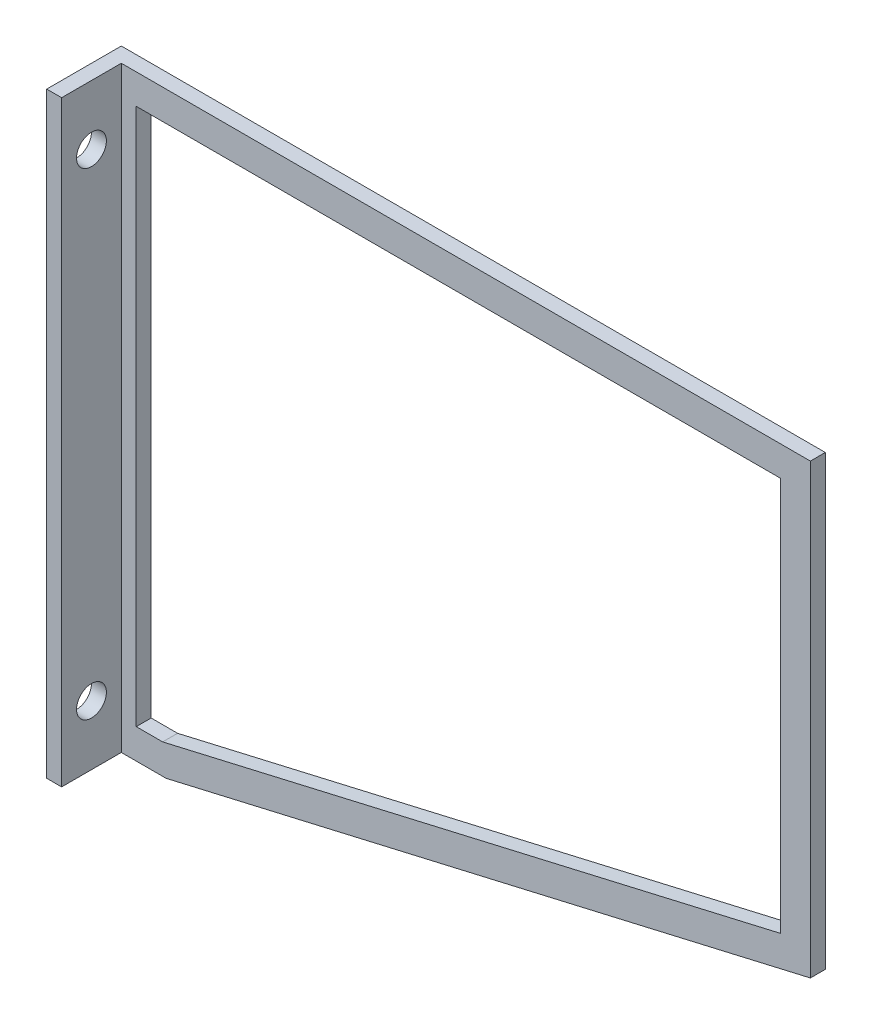
ISO-10303-21;
HEADER;
FILE_DESCRIPTION(('STEP AP214'),'2;1');
FILE_NAME('part.step','',(''),(''),'','','');
FILE_SCHEMA(('AUTOMOTIVE_DESIGN { 1 0 10303 214 1 1 1 1 }'));
ENDSEC;
DATA;
#1=APPLICATION_CONTEXT('core data for automotive mechanical design processes');
#2=APPLICATION_PROTOCOL_DEFINITION('international standard','automotive_design',2000,#1);
#3=PRODUCT_CONTEXT('',#1,'mechanical');
#4=PRODUCT('Part','Part','',(#3));
#5=PRODUCT_RELATED_PRODUCT_CATEGORY('part','',(#4));
#6=PRODUCT_DEFINITION_FORMATION('','',#4);
#7=PRODUCT_DEFINITION_CONTEXT('part definition',#1,'design');
#8=PRODUCT_DEFINITION('design','',#6,#7);
#9=PRODUCT_DEFINITION_SHAPE('','',#8);
#10=(LENGTH_UNIT() NAMED_UNIT(*) SI_UNIT(.MILLI.,.METRE.));
#11=(NAMED_UNIT(*) PLANE_ANGLE_UNIT() SI_UNIT($,.RADIAN.));
#12=(NAMED_UNIT(*) SI_UNIT($,.STERADIAN.) SOLID_ANGLE_UNIT());
#13=UNCERTAINTY_MEASURE_WITH_UNIT(LENGTH_MEASURE(1.E-05),#10,'distance_accuracy_value','');
#14=(GEOMETRIC_REPRESENTATION_CONTEXT(3) GLOBAL_UNCERTAINTY_ASSIGNED_CONTEXT((#13)) GLOBAL_UNIT_ASSIGNED_CONTEXT((#10,
#11,#12)) REPRESENTATION_CONTEXT('',''));
#15=CARTESIAN_POINT('',(0.,0.,0.));
#16=DIRECTION('',(0.,0.,1.));
#17=DIRECTION('',(1.,0.,0.));
#18=AXIS2_PLACEMENT_3D('',#15,#16,#17);
#19=CARTESIAN_POINT('',(0.,0.,5.));
#20=DIRECTION('',(0.,0.,1.));
#21=DIRECTION('',(1.,0.,0.));
#22=AXIS2_PLACEMENT_3D('',#19,#20,#21);
#23=PLANE('',#22);
#24=DIRECTION('',(0.,1.,0.));
#25=VECTOR('',#24,1.);
#26=CARTESIAN_POINT('',(5.,200.,5.));
#27=LINE('',#26,#25);
#28=CARTESIAN_POINT('',(5.00000000000001,0.,5.));
#29=VERTEX_POINT('',#28);
#30=CARTESIAN_POINT('',(5.,200.,5.));
#31=VERTEX_POINT('',#30);
#32=EDGE_CURVE('E56',#29,#31,#27,.T.);
#33=ORIENTED_EDGE('',*,*,#32,.F.);
#34=DIRECTION('',(1.,0.,0.));
#35=VECTOR('',#34,1.);
#36=CARTESIAN_POINT('',(0.,0.,5.));
#37=LINE('',#36,#35);
#38=CARTESIAN_POINT('',(20.,0.,5.));
#39=VERTEX_POINT('',#38);
#40=EDGE_CURVE('E199',#29,#39,#37,.T.);
#41=ORIENTED_EDGE('',*,*,#40,.T.);
#42=DIRECTION('',(0.974211529694991,0.225636644650964,0.));
#43=VECTOR('',#42,1.);
#44=CARTESIAN_POINT('',(20.,0.,5.));
#45=LINE('',#44,#43);
#46=CARTESIAN_POINT('',(235.880609996217,50.,5.));
#47=VERTEX_POINT('',#46);
#48=EDGE_CURVE('E201',#39,#47,#45,.T.);
#49=ORIENTED_EDGE('',*,*,#48,.T.);
#50=DIRECTION('',(0.,1.,0.));
#51=VECTOR('',#50,1.);
#52=CARTESIAN_POINT('',(235.880609996217,50.,5.));
#53=LINE('',#52,#51);
#54=CARTESIAN_POINT('',(235.880609996217,200.,5.));
#55=VERTEX_POINT('',#54);
#56=EDGE_CURVE('E204',#47,#55,#53,.T.);
#57=ORIENTED_EDGE('',*,*,#56,.T.);
#58=DIRECTION('',(-1.,0.,0.));
#59=VECTOR('',#58,1.);
#60=CARTESIAN_POINT('',(235.880609996217,200.,5.));
#61=LINE('',#60,#59);
#62=EDGE_CURVE('E206',#55,#31,#61,.T.);
#63=ORIENTED_EDGE('',*,*,#62,.T.);
#64=EDGE_LOOP('',(#33,#41,#49,#57,#63));
#65=FACE_BOUND('',#64,.T.);
#66=DIRECTION('',(1.,0.,0.));
#67=VECTOR('',#66,1.);
#68=CARTESIAN_POINT('',(18.8570796935534,10.,5.));
#69=LINE('',#68,#67);
#70=CARTESIAN_POINT('',(10.,10.,5.));
#71=VERTEX_POINT('',#70);
#72=CARTESIAN_POINT('',(18.8570796935534,10.,5.));
#73=VERTEX_POINT('',#72);
#74=EDGE_CURVE('E166',#71,#73,#69,.T.);
#75=ORIENTED_EDGE('',*,*,#74,.F.);
#76=DIRECTION('',(0.,-1.,0.));
#77=VECTOR('',#76,1.);
#78=CARTESIAN_POINT('',(10.,10.,5.));
#79=LINE('',#78,#77);
#80=CARTESIAN_POINT('',(10.,190.,5.));
#81=VERTEX_POINT('',#80);
#82=EDGE_CURVE('E164',#81,#71,#79,.T.);
#83=ORIENTED_EDGE('',*,*,#82,.F.);
#84=DIRECTION('',(-1.,0.,0.));
#85=VECTOR('',#84,1.);
#86=CARTESIAN_POINT('',(10.,190.,5.));
#87=LINE('',#86,#85);
#88=CARTESIAN_POINT('',(225.880609996217,190.,5.));
#89=VERTEX_POINT('',#88);
#90=EDGE_CURVE('E173',#89,#81,#87,.T.);
#91=ORIENTED_EDGE('',*,*,#90,.F.);
#92=DIRECTION('',(0.,1.,0.));
#93=VECTOR('',#92,1.);
#94=CARTESIAN_POINT('',(225.880609996217,190.,5.));
#95=LINE('',#94,#93);
#96=CARTESIAN_POINT('',(225.880609996217,57.9486162064976,5.));
#97=VERTEX_POINT('',#96);
#98=EDGE_CURVE('E171',#97,#89,#95,.T.);
#99=ORIENTED_EDGE('',*,*,#98,.F.);
#100=DIRECTION('',(0.974211529694991,0.225636644650964,0.));
#101=VECTOR('',#100,1.);
#102=CARTESIAN_POINT('',(225.880609996217,57.9486162064976,5.));
#103=LINE('',#102,#101);
#104=EDGE_CURVE('E169',#73,#97,#103,.T.);
#105=ORIENTED_EDGE('',*,*,#104,.F.);
#106=EDGE_LOOP('',(#75,#83,#91,#99,#105));
#107=FACE_BOUND('',#106,.T.);
#108=ADVANCED_FACE('F41',(#65,#107),#23,.T.);
#109=CARTESIAN_POINT('',(0.,0.,0.));
#110=DIRECTION('',(0.,0.,1.));
#111=DIRECTION('',(1.,0.,0.));
#112=AXIS2_PLACEMENT_3D('',#109,#110,#111);
#113=PLANE('',#112);
#114=DIRECTION('',(0.,-1.,0.));
#115=VECTOR('',#114,1.);
#116=CARTESIAN_POINT('',(0.,200.,0.));
#117=LINE('',#116,#115);
#118=CARTESIAN_POINT('',(0.,200.,0.));
#119=VERTEX_POINT('',#118);
#120=CARTESIAN_POINT('',(0.,0.,0.));
#121=VERTEX_POINT('',#120);
#122=EDGE_CURVE('E135',#119,#121,#117,.T.);
#123=ORIENTED_EDGE('',*,*,#122,.F.);
#124=DIRECTION('',(-1.,0.,0.));
#125=VECTOR('',#124,1.);
#126=CARTESIAN_POINT('',(235.880609996217,200.,0.));
#127=LINE('',#126,#125);
#128=CARTESIAN_POINT('',(235.880609996217,200.,0.));
#129=VERTEX_POINT('',#128);
#130=EDGE_CURVE('E202',#129,#119,#127,.T.);
#131=ORIENTED_EDGE('',*,*,#130,.F.);
#132=DIRECTION('',(0.,1.,0.));
#133=VECTOR('',#132,1.);
#134=CARTESIAN_POINT('',(235.880609996217,50.,0.));
#135=LINE('',#134,#133);
#136=CARTESIAN_POINT('',(235.880609996217,50.,0.));
#137=VERTEX_POINT('',#136);
#138=EDGE_CURVE('E214',#137,#129,#135,.T.);
#139=ORIENTED_EDGE('',*,*,#138,.F.);
#140=DIRECTION('',(0.974211529694991,0.225636644650964,0.));
#141=VECTOR('',#140,1.);
#142=CARTESIAN_POINT('',(20.,0.,0.));
#143=LINE('',#142,#141);
#144=CARTESIAN_POINT('',(20.,0.,0.));
#145=VERTEX_POINT('',#144);
#146=EDGE_CURVE('E212',#145,#137,#143,.T.);
#147=ORIENTED_EDGE('',*,*,#146,.F.);
#148=DIRECTION('',(1.,0.,0.));
#149=VECTOR('',#148,1.);
#150=CARTESIAN_POINT('',(0.,0.,0.));
#151=LINE('',#150,#149);
#152=EDGE_CURVE('E210',#121,#145,#151,.T.);
#153=ORIENTED_EDGE('',*,*,#152,.F.);
#154=EDGE_LOOP('',(#123,#131,#139,#147,#153));
#155=FACE_BOUND('',#154,.T.);
#156=DIRECTION('',(0.,-1.,0.));
#157=VECTOR('',#156,1.);
#158=CARTESIAN_POINT('',(10.,10.,0.));
#159=LINE('',#158,#157);
#160=CARTESIAN_POINT('',(10.,190.,0.));
#161=VERTEX_POINT('',#160);
#162=CARTESIAN_POINT('',(10.,10.,0.));
#163=VERTEX_POINT('',#162);
#164=EDGE_CURVE('E163',#161,#163,#159,.T.);
#165=ORIENTED_EDGE('',*,*,#164,.T.);
#166=DIRECTION('',(1.,0.,0.));
#167=VECTOR('',#166,1.);
#168=CARTESIAN_POINT('',(18.8570796935534,10.,0.));
#169=LINE('',#168,#167);
#170=CARTESIAN_POINT('',(18.8570796935534,10.,0.));
#171=VERTEX_POINT('',#170);
#172=EDGE_CURVE('E178',#163,#171,#169,.T.);
#173=ORIENTED_EDGE('',*,*,#172,.T.);
#174=DIRECTION('',(0.974211529694991,0.225636644650964,0.));
#175=VECTOR('',#174,1.);
#176=CARTESIAN_POINT('',(225.880609996217,57.9486162064976,0.));
#177=LINE('',#176,#175);
#178=CARTESIAN_POINT('',(225.880609996217,57.9486162064976,0.));
#179=VERTEX_POINT('',#178);
#180=EDGE_CURVE('E181',#171,#179,#177,.T.);
#181=ORIENTED_EDGE('',*,*,#180,.T.);
#182=DIRECTION('',(0.,1.,0.));
#183=VECTOR('',#182,1.);
#184=CARTESIAN_POINT('',(225.880609996217,190.,0.));
#185=LINE('',#184,#183);
#186=CARTESIAN_POINT('',(225.880609996217,190.,0.));
#187=VERTEX_POINT('',#186);
#188=EDGE_CURVE('E184',#179,#187,#185,.T.);
#189=ORIENTED_EDGE('',*,*,#188,.T.);
#190=DIRECTION('',(-1.,0.,0.));
#191=VECTOR('',#190,1.);
#192=CARTESIAN_POINT('',(10.,190.,0.));
#193=LINE('',#192,#191);
#194=EDGE_CURVE('E167',#187,#161,#193,.T.);
#195=ORIENTED_EDGE('',*,*,#194,.T.);
#196=EDGE_LOOP('',(#165,#173,#181,#189,#195));
#197=FACE_BOUND('',#196,.T.);
#198=ADVANCED_FACE('F232',(#155,#197),#113,.F.);
#199=CARTESIAN_POINT('',(0.,200.,5.));
#200=DIRECTION('',(1.,0.,0.));
#201=DIRECTION('',(0.,0.,-1.));
#202=AXIS2_PLACEMENT_3D('',#199,#200,#201);
#203=PLANE('',#202);
#204=CARTESIAN_POINT('',(0.,180.,15.));
#205=DIRECTION('',(1.,0.,0.));
#206=DIRECTION('',(0.,1.,0.));
#207=AXIS2_PLACEMENT_3D('',#204,#205,#206);
#208=CIRCLE('',#207,5.);
#209=CARTESIAN_POINT('',(0.,185.,15.));
#210=VERTEX_POINT('',#209);
#211=EDGE_CURVE('E151',#210,#210,#208,.T.);
#212=ORIENTED_EDGE('',*,*,#211,.T.);
#213=EDGE_LOOP('',(#212));
#214=FACE_BOUND('',#213,.T.);
#215=CARTESIAN_POINT('',(0.,20.,15.));
#216=DIRECTION('',(1.,0.,0.));
#217=DIRECTION('',(0.,1.,0.));
#218=AXIS2_PLACEMENT_3D('',#215,#216,#217);
#219=CIRCLE('',#218,5.);
#220=CARTESIAN_POINT('',(0.,25.,15.));
#221=VERTEX_POINT('',#220);
#222=EDGE_CURVE('E287',#221,#221,#219,.T.);
#223=ORIENTED_EDGE('',*,*,#222,.T.);
#224=EDGE_LOOP('',(#223));
#225=FACE_BOUND('',#224,.T.);
#226=ORIENTED_EDGE('',*,*,#122,.T.);
#227=DIRECTION('',(0.,0.,-1.));
#228=VECTOR('',#227,1.);
#229=CARTESIAN_POINT('',(0.,0.,5.));
#230=LINE('',#229,#228);
#231=CARTESIAN_POINT('',(0.,0.,25.));
#232=VERTEX_POINT('',#231);
#233=EDGE_CURVE('E11',#232,#121,#230,.T.);
#234=ORIENTED_EDGE('',*,*,#233,.F.);
#235=DIRECTION('',(0.,-1.,0.));
#236=VECTOR('',#235,1.);
#237=CARTESIAN_POINT('',(0.,200.,25.));
#238=LINE('',#237,#236);
#239=CARTESIAN_POINT('',(0.,200.,25.));
#240=VERTEX_POINT('',#239);
#241=EDGE_CURVE('E133',#240,#232,#238,.T.);
#242=ORIENTED_EDGE('',*,*,#241,.F.);
#243=DIRECTION('',(0.,0.,-1.));
#244=VECTOR('',#243,1.);
#245=CARTESIAN_POINT('',(0.,200.,5.));
#246=LINE('',#245,#244);
#247=EDGE_CURVE('E208',#240,#119,#246,.T.);
#248=ORIENTED_EDGE('',*,*,#247,.T.);
#249=EDGE_LOOP('',(#226,#234,#242,#248));
#250=FACE_BOUND('',#249,.T.);
#251=ADVANCED_FACE('F43',(#214,#225,#250),#203,.F.);
#252=CARTESIAN_POINT('',(0.,0.,5.));
#253=DIRECTION('',(0.,1.,0.));
#254=DIRECTION('',(0.,0.,1.));
#255=AXIS2_PLACEMENT_3D('',#252,#253,#254);
#256=PLANE('',#255);
#257=ORIENTED_EDGE('',*,*,#152,.T.);
#258=DIRECTION('',(0.,0.,-1.));
#259=VECTOR('',#258,1.);
#260=CARTESIAN_POINT('',(20.,0.,5.));
#261=LINE('',#260,#259);
#262=EDGE_CURVE('E49',#39,#145,#261,.T.);
#263=ORIENTED_EDGE('',*,*,#262,.F.);
#264=ORIENTED_EDGE('',*,*,#40,.F.);
#265=DIRECTION('',(0.,0.,-1.));
#266=VECTOR('',#265,1.);
#267=CARTESIAN_POINT('',(5.00000000000002,0.,25.));
#268=LINE('',#267,#266);
#269=CARTESIAN_POINT('',(5.00000000000002,0.,25.));
#270=VERTEX_POINT('',#269);
#271=EDGE_CURVE('E141',#270,#29,#268,.T.);
#272=ORIENTED_EDGE('',*,*,#271,.F.);
#273=DIRECTION('',(1.,0.,0.));
#274=VECTOR('',#273,1.);
#275=CARTESIAN_POINT('',(0.,0.,25.));
#276=LINE('',#275,#274);
#277=EDGE_CURVE('E138',#232,#270,#276,.T.);
#278=ORIENTED_EDGE('',*,*,#277,.F.);
#279=ORIENTED_EDGE('',*,*,#233,.T.);
#280=EDGE_LOOP('',(#257,#263,#264,#272,#278,#279));
#281=FACE_BOUND('',#280,.T.);
#282=ADVANCED_FACE('F139',(#281),#256,.F.);
#283=CARTESIAN_POINT('',(20.,0.,5.));
#284=DIRECTION('',(-0.225636644650964,0.974211529694991,0.));
#285=DIRECTION('',(-0.974211529694991,-0.225636644650964,0.));
#286=AXIS2_PLACEMENT_3D('',#283,#284,#285);
#287=PLANE('',#286);
#288=ORIENTED_EDGE('',*,*,#146,.T.);
#289=DIRECTION('',(0.,0.,-1.));
#290=VECTOR('',#289,1.);
#291=CARTESIAN_POINT('',(235.880609996217,50.,5.));
#292=LINE('',#291,#290);
#293=EDGE_CURVE('E221',#47,#137,#292,.T.);
#294=ORIENTED_EDGE('',*,*,#293,.F.);
#295=ORIENTED_EDGE('',*,*,#48,.F.);
#296=ORIENTED_EDGE('',*,*,#262,.T.);
#297=EDGE_LOOP('',(#288,#294,#295,#296));
#298=FACE_BOUND('',#297,.T.);
#299=ADVANCED_FACE('F228',(#298),#287,.F.);
#300=CARTESIAN_POINT('',(235.880609996217,50.,5.));
#301=DIRECTION('',(-1.,0.,0.));
#302=DIRECTION('',(0.,0.,1.));
#303=AXIS2_PLACEMENT_3D('',#300,#301,#302);
#304=PLANE('',#303);
#305=ORIENTED_EDGE('',*,*,#138,.T.);
#306=DIRECTION('',(0.,0.,-1.));
#307=VECTOR('',#306,1.);
#308=CARTESIAN_POINT('',(235.880609996217,200.,5.));
#309=LINE('',#308,#307);
#310=EDGE_CURVE('E218',#55,#129,#309,.T.);
#311=ORIENTED_EDGE('',*,*,#310,.F.);
#312=ORIENTED_EDGE('',*,*,#56,.F.);
#313=ORIENTED_EDGE('',*,*,#293,.T.);
#314=EDGE_LOOP('',(#305,#311,#312,#313));
#315=FACE_BOUND('',#314,.T.);
#316=ADVANCED_FACE('F237',(#315),#304,.F.);
#317=CARTESIAN_POINT('',(235.880609996217,200.,5.));
#318=DIRECTION('',(0.,-1.,0.));
#319=DIRECTION('',(0.,0.,-1.));
#320=AXIS2_PLACEMENT_3D('',#317,#318,#319);
#321=PLANE('',#320);
#322=ORIENTED_EDGE('',*,*,#130,.T.);
#323=ORIENTED_EDGE('',*,*,#247,.F.);
#324=DIRECTION('',(-1.,0.,0.));
#325=VECTOR('',#324,1.);
#326=CARTESIAN_POINT('',(0.,200.,25.));
#327=LINE('',#326,#325);
#328=CARTESIAN_POINT('',(5.,200.,25.));
#329=VERTEX_POINT('',#328);
#330=EDGE_CURVE('E149',#329,#240,#327,.T.);
#331=ORIENTED_EDGE('',*,*,#330,.F.);
#332=DIRECTION('',(0.,0.,-1.));
#333=VECTOR('',#332,1.);
#334=CARTESIAN_POINT('',(5.,200.,25.));
#335=LINE('',#334,#333);
#336=EDGE_CURVE('E158',#329,#31,#335,.T.);
#337=ORIENTED_EDGE('',*,*,#336,.T.);
#338=ORIENTED_EDGE('',*,*,#62,.F.);
#339=ORIENTED_EDGE('',*,*,#310,.T.);
#340=EDGE_LOOP('',(#322,#323,#331,#337,#338,#339));
#341=FACE_BOUND('',#340,.T.);
#342=ADVANCED_FACE('F241',(#341),#321,.F.);
#343=CARTESIAN_POINT('',(10.,10.,5.));
#344=DIRECTION('',(1.,0.,0.));
#345=DIRECTION('',(0.,0.,-1.));
#346=AXIS2_PLACEMENT_3D('',#343,#344,#345);
#347=PLANE('',#346);
#348=ORIENTED_EDGE('',*,*,#164,.F.);
#349=DIRECTION('',(0.,0.,-1.));
#350=VECTOR('',#349,1.);
#351=CARTESIAN_POINT('',(10.,190.,5.));
#352=LINE('',#351,#350);
#353=EDGE_CURVE('E175',#81,#161,#352,.T.);
#354=ORIENTED_EDGE('',*,*,#353,.F.);
#355=ORIENTED_EDGE('',*,*,#82,.T.);
#356=DIRECTION('',(0.,0.,-1.));
#357=VECTOR('',#356,1.);
#358=CARTESIAN_POINT('',(10.,10.,5.));
#359=LINE('',#358,#357);
#360=EDGE_CURVE('E196',#71,#163,#359,.T.);
#361=ORIENTED_EDGE('',*,*,#360,.T.);
#362=EDGE_LOOP('',(#348,#354,#355,#361));
#363=FACE_BOUND('',#362,.T.);
#364=ADVANCED_FACE('F267',(#363),#347,.T.);
#365=CARTESIAN_POINT('',(18.8570796935534,10.,5.));
#366=DIRECTION('',(0.,1.,0.));
#367=DIRECTION('',(0.,0.,1.));
#368=AXIS2_PLACEMENT_3D('',#365,#366,#367);
#369=PLANE('',#368);
#370=ORIENTED_EDGE('',*,*,#172,.F.);
#371=ORIENTED_EDGE('',*,*,#360,.F.);
#372=ORIENTED_EDGE('',*,*,#74,.T.);
#373=DIRECTION('',(0.,0.,-1.));
#374=VECTOR('',#373,1.);
#375=CARTESIAN_POINT('',(18.8570796935534,10.,5.));
#376=LINE('',#375,#374);
#377=EDGE_CURVE('E194',#73,#171,#376,.T.);
#378=ORIENTED_EDGE('',*,*,#377,.T.);
#379=EDGE_LOOP('',(#370,#371,#372,#378));
#380=FACE_BOUND('',#379,.T.);
#381=ADVANCED_FACE('F373',(#380),#369,.T.);
#382=CARTESIAN_POINT('',(225.880609996217,57.9486162064976,5.));
#383=DIRECTION('',(-0.225636644650964,0.974211529694991,0.));
#384=DIRECTION('',(-0.974211529694991,-0.225636644650964,0.));
#385=AXIS2_PLACEMENT_3D('',#382,#383,#384);
#386=PLANE('',#385);
#387=ORIENTED_EDGE('',*,*,#180,.F.);
#388=ORIENTED_EDGE('',*,*,#377,.F.);
#389=ORIENTED_EDGE('',*,*,#104,.T.);
#390=DIRECTION('',(0.,0.,-1.));
#391=VECTOR('',#390,1.);
#392=CARTESIAN_POINT('',(225.880609996217,57.9486162064976,5.));
#393=LINE('',#392,#391);
#394=EDGE_CURVE('E192',#97,#179,#393,.T.);
#395=ORIENTED_EDGE('',*,*,#394,.T.);
#396=EDGE_LOOP('',(#387,#388,#389,#395));
#397=FACE_BOUND('',#396,.T.);
#398=ADVANCED_FACE('F363',(#397),#386,.T.);
#399=CARTESIAN_POINT('',(225.880609996217,190.,5.));
#400=DIRECTION('',(-1.,0.,0.));
#401=DIRECTION('',(0.,-1.,0.));
#402=AXIS2_PLACEMENT_3D('',#399,#400,#401);
#403=PLANE('',#402);
#404=ORIENTED_EDGE('',*,*,#188,.F.);
#405=ORIENTED_EDGE('',*,*,#394,.F.);
#406=ORIENTED_EDGE('',*,*,#98,.T.);
#407=DIRECTION('',(0.,0.,-1.));
#408=VECTOR('',#407,1.);
#409=CARTESIAN_POINT('',(225.880609996217,190.,5.));
#410=LINE('',#409,#408);
#411=EDGE_CURVE('E64',#89,#187,#410,.T.);
#412=ORIENTED_EDGE('',*,*,#411,.T.);
#413=EDGE_LOOP('',(#404,#405,#406,#412));
#414=FACE_BOUND('',#413,.T.);
#415=ADVANCED_FACE('F256',(#414),#403,.T.);
#416=CARTESIAN_POINT('',(10.,190.,5.));
#417=DIRECTION('',(0.,-1.,0.));
#418=DIRECTION('',(0.,0.,-1.));
#419=AXIS2_PLACEMENT_3D('',#416,#417,#418);
#420=PLANE('',#419);
#421=ORIENTED_EDGE('',*,*,#194,.F.);
#422=ORIENTED_EDGE('',*,*,#411,.F.);
#423=ORIENTED_EDGE('',*,*,#90,.T.);
#424=ORIENTED_EDGE('',*,*,#353,.T.);
#425=EDGE_LOOP('',(#421,#422,#423,#424));
#426=FACE_BOUND('',#425,.T.);
#427=ADVANCED_FACE('F247',(#426),#420,.T.);
#428=CARTESIAN_POINT('',(5.,200.,25.));
#429=DIRECTION('',(-1.,0.,0.));
#430=DIRECTION('',(0.,-1.,0.));
#431=AXIS2_PLACEMENT_3D('',#428,#429,#430);
#432=PLANE('',#431);
#433=CARTESIAN_POINT('',(5.,180.,15.));
#434=DIRECTION('',(1.,0.,0.));
#435=DIRECTION('',(0.,1.,0.));
#436=AXIS2_PLACEMENT_3D('',#433,#434,#435);
#437=CIRCLE('',#436,5.);
#438=CARTESIAN_POINT('',(5.,185.,15.));
#439=VERTEX_POINT('',#438);
#440=EDGE_CURVE('E289',#439,#439,#437,.T.);
#441=ORIENTED_EDGE('',*,*,#440,.F.);
#442=EDGE_LOOP('',(#441));
#443=FACE_BOUND('',#442,.T.);
#444=CARTESIAN_POINT('',(5.00000000000002,20.,15.));
#445=DIRECTION('',(1.,0.,0.));
#446=DIRECTION('',(0.,1.,0.));
#447=AXIS2_PLACEMENT_3D('',#444,#445,#446);
#448=CIRCLE('',#447,5.);
#449=CARTESIAN_POINT('',(5.00000000000002,25.,15.));
#450=VERTEX_POINT('',#449);
#451=EDGE_CURVE('E154',#450,#450,#448,.T.);
#452=ORIENTED_EDGE('',*,*,#451,.F.);
#453=EDGE_LOOP('',(#452));
#454=FACE_BOUND('',#453,.T.);
#455=ORIENTED_EDGE('',*,*,#32,.T.);
#456=ORIENTED_EDGE('',*,*,#336,.F.);
#457=DIRECTION('',(0.,1.,0.));
#458=VECTOR('',#457,1.);
#459=CARTESIAN_POINT('',(5.,200.,25.));
#460=LINE('',#459,#458);
#461=EDGE_CURVE('E144',#270,#329,#460,.T.);
#462=ORIENTED_EDGE('',*,*,#461,.F.);
#463=ORIENTED_EDGE('',*,*,#271,.T.);
#464=EDGE_LOOP('',(#455,#456,#462,#463));
#465=FACE_BOUND('',#464,.T.);
#466=ADVANCED_FACE('F245',(#443,#454,#465),#432,.F.);
#467=CARTESIAN_POINT('',(0.,0.,25.));
#468=DIRECTION('',(0.,0.,1.));
#469=DIRECTION('',(1.,0.,0.));
#470=AXIS2_PLACEMENT_3D('',#467,#468,#469);
#471=PLANE('',#470);
#472=ORIENTED_EDGE('',*,*,#241,.T.);
#473=ORIENTED_EDGE('',*,*,#277,.T.);
#474=ORIENTED_EDGE('',*,*,#461,.T.);
#475=ORIENTED_EDGE('',*,*,#330,.T.);
#476=EDGE_LOOP('',(#472,#473,#474,#475));
#477=FACE_BOUND('',#476,.T.);
#478=ADVANCED_FACE('F147',(#477),#471,.T.);
#479=CARTESIAN_POINT('',(0.,20.,15.));
#480=DIRECTION('',(1.,0.,0.));
#481=DIRECTION('',(0.,1.,0.));
#482=AXIS2_PLACEMENT_3D('',#479,#480,#481);
#483=CYLINDRICAL_SURFACE('',#482,5.);
#484=CARTESIAN_POINT('',(0.,25.,15.));
#485=CARTESIAN_POINT('',(0.0520833333333304,25.,15.));
#486=CARTESIAN_POINT('',(0.104166666666664,25.,15.));
#487=CARTESIAN_POINT('',(0.208333333333331,25.,15.));
#488=CARTESIAN_POINT('',(0.260416666666665,25.,15.));
#489=CARTESIAN_POINT('',(0.364583333333332,25.,15.));
#490=CARTESIAN_POINT('',(0.416666666666666,25.,15.));
#491=CARTESIAN_POINT('',(0.520833333333333,25.,15.));
#492=CARTESIAN_POINT('',(0.572916666666666,25.,15.));
#493=CARTESIAN_POINT('',(0.677083333333334,25.,15.));
#494=CARTESIAN_POINT('',(0.729166666666667,25.,15.));
#495=CARTESIAN_POINT('',(0.833333333333334,25.,15.));
#496=CARTESIAN_POINT('',(0.885416666666668,25.,15.));
#497=CARTESIAN_POINT('',(0.989583333333335,25.,15.));
#498=CARTESIAN_POINT('',(1.04166666666667,25.,15.));
#499=CARTESIAN_POINT('',(1.14583333333334,25.,15.));
#500=CARTESIAN_POINT('',(1.19791666666667,25.,15.));
#501=CARTESIAN_POINT('',(1.30208333333334,25.,15.));
#502=CARTESIAN_POINT('',(1.35416666666667,25.,15.));
#503=CARTESIAN_POINT('',(1.45833333333334,25.,15.));
#504=CARTESIAN_POINT('',(1.51041666666667,25.,15.));
#505=CARTESIAN_POINT('',(1.61458333333334,25.,15.));
#506=CARTESIAN_POINT('',(1.66666666666667,25.,15.));
#507=CARTESIAN_POINT('',(1.77083333333334,25.,15.));
#508=CARTESIAN_POINT('',(1.82291666666667,25.,15.));
#509=CARTESIAN_POINT('',(1.92708333333334,25.,15.));
#510=CARTESIAN_POINT('',(1.97916666666667,25.,15.));
#511=CARTESIAN_POINT('',(2.08333333333334,25.,15.));
#512=CARTESIAN_POINT('',(2.13541666666667,25.,15.));
#513=CARTESIAN_POINT('',(2.23958333333334,25.,15.));
#514=CARTESIAN_POINT('',(2.29166666666668,25.,15.));
#515=CARTESIAN_POINT('',(2.39583333333334,25.,15.));
#516=CARTESIAN_POINT('',(2.44791666666668,25.,15.));
#517=CARTESIAN_POINT('',(2.55208333333334,25.,15.));
#518=CARTESIAN_POINT('',(2.60416666666668,25.,15.));
#519=CARTESIAN_POINT('',(2.70833333333334,25.,15.));
#520=CARTESIAN_POINT('',(2.76041666666668,25.,15.));
#521=CARTESIAN_POINT('',(2.86458333333335,25.,15.));
#522=CARTESIAN_POINT('',(2.91666666666668,25.,15.));
#523=CARTESIAN_POINT('',(3.02083333333335,25.,15.));
#524=CARTESIAN_POINT('',(3.07291666666668,25.,15.));
#525=CARTESIAN_POINT('',(3.17708333333335,25.,15.));
#526=CARTESIAN_POINT('',(3.22916666666668,25.,15.));
#527=CARTESIAN_POINT('',(3.33333333333335,25.,15.));
#528=CARTESIAN_POINT('',(3.38541666666668,25.,15.));
#529=CARTESIAN_POINT('',(3.48958333333335,25.,15.));
#530=CARTESIAN_POINT('',(3.54166666666668,25.,15.));
#531=CARTESIAN_POINT('',(3.64583333333335,25.,15.));
#532=CARTESIAN_POINT('',(3.69791666666668,25.,15.));
#533=CARTESIAN_POINT('',(3.80208333333335,25.,15.));
#534=CARTESIAN_POINT('',(3.85416666666668,25.,15.));
#535=CARTESIAN_POINT('',(3.95833333333335,25.,15.));
#536=CARTESIAN_POINT('',(4.01041666666668,25.,15.));
#537=CARTESIAN_POINT('',(4.11458333333335,25.,15.));
#538=CARTESIAN_POINT('',(4.16666666666668,25.,15.));
#539=CARTESIAN_POINT('',(4.27083333333335,25.,15.));
#540=CARTESIAN_POINT('',(4.32291666666669,25.,15.));
#541=CARTESIAN_POINT('',(4.42708333333335,25.,15.));
#542=CARTESIAN_POINT('',(4.47916666666669,25.,15.));
#543=CARTESIAN_POINT('',(4.58333333333335,25.,15.));
#544=CARTESIAN_POINT('',(4.63541666666669,25.,15.));
#545=CARTESIAN_POINT('',(4.73958333333335,25.,15.));
#546=CARTESIAN_POINT('',(4.79166666666669,25.,15.));
#547=CARTESIAN_POINT('',(4.89583333333336,25.,15.));
#548=CARTESIAN_POINT('',(4.94791666666669,25.,15.));
#549=CARTESIAN_POINT('',(5.00000000000002,25.,15.));
#550=B_SPLINE_CURVE_WITH_KNOTS('',3,(#484,#485,#486,#487,#488,#489,#490,#491,#492,#493,#494,
#495,#496,#497,#498,#499,#500,#501,#502,#503,#504,#505,#506,#507,#508,#509,#510,#511,#512,#513,
#514,#515,#516,#517,#518,#519,#520,#521,#522,#523,#524,#525,#526,#527,#528,#529,#530,#531,#532,
#533,#534,#535,#536,#537,#538,#539,#540,#541,#542,#543,#544,#545,#546,#547,#548,#549),
.UNSPECIFIED.,.F.,.F.,(4,2,2,2,2,2,2,2,2,2,2,2,2,2,2,2,2,2,2,2,2,2,2,2,2,2,2,2,2,2,2,2,4),(0.,
0.156250000000001,0.312500000000002,0.468750000000002,0.625000000000003,0.781250000000004,
0.937500000000005,1.09375000000001,1.25000000000001,1.40625000000001,1.56250000000001,
1.71875000000001,1.87500000000001,2.03125000000001,2.18750000000001,2.34375000000001,
2.50000000000001,2.65625000000001,2.81250000000001,2.96875000000002,3.12500000000002,
3.28125000000002,3.43750000000002,3.59375000000002,3.75000000000002,3.90625000000002,
4.06250000000002,4.21875000000002,4.37500000000002,4.53125000000002,4.68750000000002,
4.84375000000002,5.00000000000002),.UNSPECIFIED.);
#551=EDGE_CURVE('BSEAM254',#221,#450,#550,.T.);
#552=ORIENTED_EDGE('',*,*,#222,.F.);
#553=ORIENTED_EDGE('',*,*,#451,.T.);
#554=ORIENTED_EDGE('',*,*,#551,.T.);
#555=ORIENTED_EDGE('',*,*,#551,.F.);
#556=EDGE_LOOP('',(#552,#554,#553,#555));
#557=FACE_BOUND('',#556,.T.);
#558=ADVANCED_FACE('F254',(#557),#483,.F.);
#559=CARTESIAN_POINT('',(0.,180.,15.));
#560=DIRECTION('',(1.,0.,0.));
#561=DIRECTION('',(0.,1.,0.));
#562=AXIS2_PLACEMENT_3D('',#559,#560,#561);
#563=CYLINDRICAL_SURFACE('',#562,5.);
#564=CARTESIAN_POINT('',(0.,185.,15.));
#565=CARTESIAN_POINT('',(0.0520833333333104,185.,15.));
#566=CARTESIAN_POINT('',(0.104166666666644,185.,15.));
#567=CARTESIAN_POINT('',(0.208333333333311,185.,15.));
#568=CARTESIAN_POINT('',(0.260416666666645,185.,15.));
#569=CARTESIAN_POINT('',(0.364583333333312,185.,15.));
#570=CARTESIAN_POINT('',(0.416666666666646,185.,15.));
#571=CARTESIAN_POINT('',(0.520833333333313,185.,15.));
#572=CARTESIAN_POINT('',(0.572916666666647,185.,15.));
#573=CARTESIAN_POINT('',(0.677083333333314,185.,15.));
#574=CARTESIAN_POINT('',(0.729166666666647,185.,15.));
#575=CARTESIAN_POINT('',(0.833333333333314,185.,15.));
#576=CARTESIAN_POINT('',(0.885416666666648,185.,15.));
#577=CARTESIAN_POINT('',(0.989583333333315,185.,15.));
#578=CARTESIAN_POINT('',(1.04166666666665,185.,15.));
#579=CARTESIAN_POINT('',(1.14583333333332,185.,15.));
#580=CARTESIAN_POINT('',(1.19791666666665,185.,15.));
#581=CARTESIAN_POINT('',(1.30208333333332,185.,15.));
#582=CARTESIAN_POINT('',(1.35416666666665,185.,15.));
#583=CARTESIAN_POINT('',(1.45833333333332,185.,15.));
#584=CARTESIAN_POINT('',(1.51041666666665,185.,15.));
#585=CARTESIAN_POINT('',(1.61458333333332,185.,15.));
#586=CARTESIAN_POINT('',(1.66666666666665,185.,15.));
#587=CARTESIAN_POINT('',(1.77083333333332,185.,15.));
#588=CARTESIAN_POINT('',(1.82291666666665,185.,15.));
#589=CARTESIAN_POINT('',(1.92708333333332,185.,15.));
#590=CARTESIAN_POINT('',(1.97916666666665,185.,15.));
#591=CARTESIAN_POINT('',(2.08333333333332,185.,15.));
#592=CARTESIAN_POINT('',(2.13541666666665,185.,15.));
#593=CARTESIAN_POINT('',(2.23958333333332,185.,15.));
#594=CARTESIAN_POINT('',(2.29166666666666,185.,15.));
#595=CARTESIAN_POINT('',(2.39583333333332,185.,15.));
#596=CARTESIAN_POINT('',(2.44791666666666,185.,15.));
#597=CARTESIAN_POINT('',(2.55208333333332,185.,15.));
#598=CARTESIAN_POINT('',(2.60416666666666,185.,15.));
#599=CARTESIAN_POINT('',(2.70833333333332,185.,15.));
#600=CARTESIAN_POINT('',(2.76041666666666,185.,15.));
#601=CARTESIAN_POINT('',(2.86458333333333,185.,15.));
#602=CARTESIAN_POINT('',(2.91666666666666,185.,15.));
#603=CARTESIAN_POINT('',(3.02083333333333,185.,15.));
#604=CARTESIAN_POINT('',(3.07291666666666,185.,15.));
#605=CARTESIAN_POINT('',(3.17708333333333,185.,15.));
#606=CARTESIAN_POINT('',(3.22916666666666,185.,15.));
#607=CARTESIAN_POINT('',(3.33333333333333,185.,15.));
#608=CARTESIAN_POINT('',(3.38541666666666,185.,15.));
#609=CARTESIAN_POINT('',(3.48958333333333,185.,15.));
#610=CARTESIAN_POINT('',(3.54166666666666,185.,15.));
#611=CARTESIAN_POINT('',(3.64583333333333,185.,15.));
#612=CARTESIAN_POINT('',(3.69791666666666,185.,15.));
#613=CARTESIAN_POINT('',(3.80208333333333,185.,15.));
#614=CARTESIAN_POINT('',(3.85416666666666,185.,15.));
#615=CARTESIAN_POINT('',(3.95833333333333,185.,15.));
#616=CARTESIAN_POINT('',(4.01041666666666,185.,15.));
#617=CARTESIAN_POINT('',(4.11458333333333,185.,15.));
#618=CARTESIAN_POINT('',(4.16666666666667,185.,15.));
#619=CARTESIAN_POINT('',(4.27083333333333,185.,15.));
#620=CARTESIAN_POINT('',(4.32291666666667,185.,15.));
#621=CARTESIAN_POINT('',(4.42708333333333,185.,15.));
#622=CARTESIAN_POINT('',(4.47916666666667,185.,15.));
#623=CARTESIAN_POINT('',(4.58333333333333,185.,15.));
#624=CARTESIAN_POINT('',(4.63541666666667,185.,15.));
#625=CARTESIAN_POINT('',(4.73958333333333,185.,15.));
#626=CARTESIAN_POINT('',(4.79166666666667,185.,15.));
#627=CARTESIAN_POINT('',(4.89583333333334,185.,15.));
#628=CARTESIAN_POINT('',(4.94791666666667,185.,15.));
#629=CARTESIAN_POINT('',(5.,185.,15.));
#630=B_SPLINE_CURVE_WITH_KNOTS('',3,(#564,#565,#566,#567,#568,#569,#570,#571,#572,#573,#574,
#575,#576,#577,#578,#579,#580,#581,#582,#583,#584,#585,#586,#587,#588,#589,#590,#591,#592,#593,
#594,#595,#596,#597,#598,#599,#600,#601,#602,#603,#604,#605,#606,#607,#608,#609,#610,#611,#612,
#613,#614,#615,#616,#617,#618,#619,#620,#621,#622,#623,#624,#625,#626,#627,#628,#629),
.UNSPECIFIED.,.F.,.F.,(4,2,2,2,2,2,2,2,2,2,2,2,2,2,2,2,2,2,2,2,2,2,2,2,2,2,2,2,2,2,2,2,4),(0.,
0.156250000000001,0.312500000000002,0.468750000000002,0.625000000000003,0.781250000000004,
0.937500000000005,1.09375000000001,1.25000000000001,1.40625000000001,1.56250000000001,
1.71875000000001,1.87500000000001,2.03125000000001,2.18750000000001,2.34375000000001,
2.50000000000001,2.65625000000001,2.81250000000001,2.96875000000002,3.12500000000002,
3.28125000000002,3.43750000000002,3.59375000000002,3.75000000000002,3.90625000000002,
4.06250000000002,4.21875000000002,4.37500000000002,4.53125000000002,4.68750000000002,
4.84375000000002,5.00000000000003),.UNSPECIFIED.);
#631=EDGE_CURVE('BSEAM297',#210,#439,#630,.T.);
#632=ORIENTED_EDGE('',*,*,#211,.F.);
#633=ORIENTED_EDGE('',*,*,#440,.T.);
#634=ORIENTED_EDGE('',*,*,#631,.T.);
#635=ORIENTED_EDGE('',*,*,#631,.F.);
#636=EDGE_LOOP('',(#632,#634,#633,#635));
#637=FACE_BOUND('',#636,.T.);
#638=ADVANCED_FACE('F297',(#637),#563,.F.);
#639=CLOSED_SHELL('',(#108,#198,#251,#282,#299,#316,#342,#364,#381,#398,#415,#427,#466,#478,
#558,#638));
#640=MANIFOLD_SOLID_BREP('B2',#639);
#641=ADVANCED_BREP_SHAPE_REPRESENTATION('',(#18,#640),#14);
#642=SHAPE_DEFINITION_REPRESENTATION(#9,#641);
ENDSEC;
END-ISO-10303-21;
